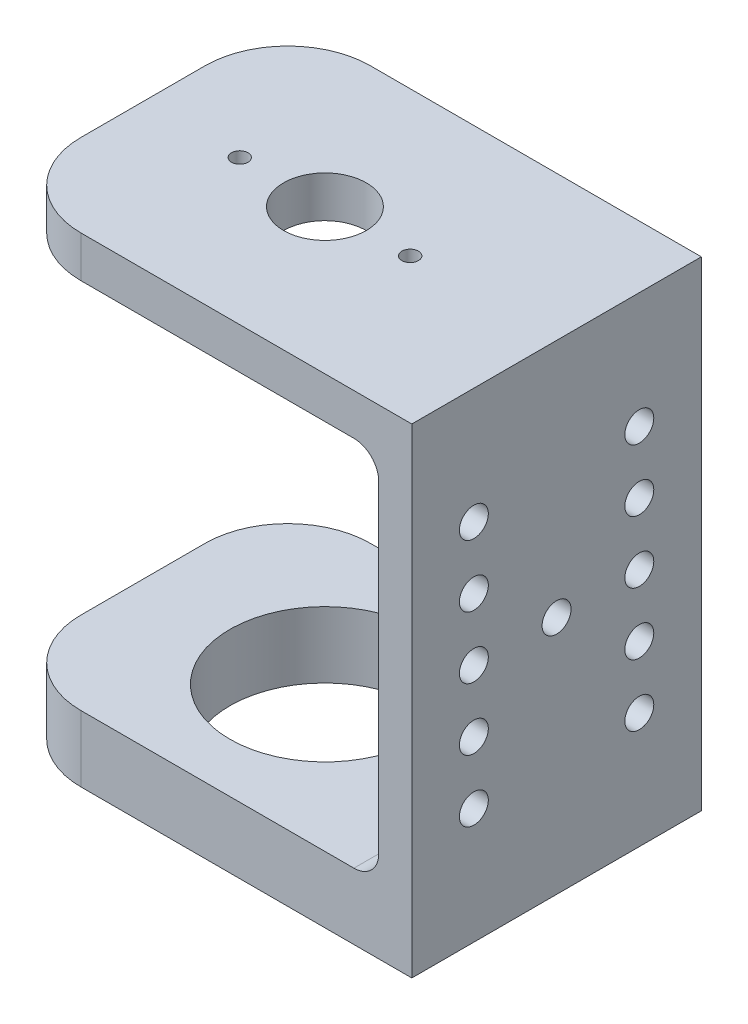
ISO-10303-21;
HEADER;
FILE_DESCRIPTION(('STEP AP214'),'2;1');
FILE_NAME('part.step','',(''),(''),'','','');
FILE_SCHEMA(('AUTOMOTIVE_DESIGN { 1 0 10303 214 1 1 1 1 }'));
ENDSEC;
DATA;
#1=APPLICATION_CONTEXT('core data for automotive mechanical design processes');
#2=APPLICATION_PROTOCOL_DEFINITION('international standard','automotive_design',2000,#1);
#3=PRODUCT_CONTEXT('',#1,'mechanical');
#4=PRODUCT('Part','Part','',(#3));
#5=PRODUCT_RELATED_PRODUCT_CATEGORY('part','',(#4));
#6=PRODUCT_DEFINITION_FORMATION('','',#4);
#7=PRODUCT_DEFINITION_CONTEXT('part definition',#1,'design');
#8=PRODUCT_DEFINITION('design','',#6,#7);
#9=PRODUCT_DEFINITION_SHAPE('','',#8);
#10=(LENGTH_UNIT() NAMED_UNIT(*) SI_UNIT(.MILLI.,.METRE.));
#11=(NAMED_UNIT(*) PLANE_ANGLE_UNIT() SI_UNIT($,.RADIAN.));
#12=(NAMED_UNIT(*) SI_UNIT($,.STERADIAN.) SOLID_ANGLE_UNIT());
#13=UNCERTAINTY_MEASURE_WITH_UNIT(LENGTH_MEASURE(1.E-05),#10,'distance_accuracy_value','');
#14=(GEOMETRIC_REPRESENTATION_CONTEXT(3) GLOBAL_UNCERTAINTY_ASSIGNED_CONTEXT((#13)) GLOBAL_UNIT_ASSIGNED_CONTEXT((#10,
#11,#12)) REPRESENTATION_CONTEXT('',''));
#15=CARTESIAN_POINT('',(0.,0.,0.));
#16=DIRECTION('',(0.,0.,1.));
#17=DIRECTION('',(1.,0.,0.));
#18=AXIS2_PLACEMENT_3D('',#15,#16,#17);
#19=CARTESIAN_POINT('',(0.,8.,0.));
#20=DIRECTION('',(0.,-1.,0.));
#21=DIRECTION('',(0.,0.,-1.));
#22=AXIS2_PLACEMENT_3D('',#19,#20,#21);
#23=PLANE('',#22);
#24=CARTESIAN_POINT('',(0.,8.,0.));
#25=DIRECTION('',(0.,1.,0.));
#26=DIRECTION('',(0.,0.,1.));
#27=AXIS2_PLACEMENT_3D('',#24,#25,#26);
#28=CIRCLE('',#27,11.5);
#29=CARTESIAN_POINT('',(0.,8.,11.5));
#30=VERTEX_POINT('',#29);
#31=EDGE_CURVE('E202',#30,#30,#28,.T.);
#32=ORIENTED_EDGE('',*,*,#31,.F.);
#33=EDGE_LOOP('',(#32));
#34=FACE_BOUND('',#33,.T.);
#35=DIRECTION('',(1.,0.,0.));
#36=VECTOR('',#35,1.);
#37=CARTESIAN_POINT('',(28.,8.,17.5));
#38=LINE('',#37,#36);
#39=CARTESIAN_POINT('',(-12.,8.,17.5));
#40=VERTEX_POINT('',#39);
#41=CARTESIAN_POINT('',(21.,8.,17.5));
#42=VERTEX_POINT('',#41);
#43=EDGE_CURVE('E178',#40,#42,#38,.T.);
#44=ORIENTED_EDGE('',*,*,#43,.T.);
#45=DIRECTION('',(0.,0.,1.));
#46=VECTOR('',#45,1.);
#47=CARTESIAN_POINT('',(21.,8.,-17.5));
#48=LINE('',#47,#46);
#49=CARTESIAN_POINT('',(21.,8.,-17.5));
#50=VERTEX_POINT('',#49);
#51=EDGE_CURVE('E74',#42,#50,#48,.F.);
#52=ORIENTED_EDGE('',*,*,#51,.T.);
#53=DIRECTION('',(-1.,0.,0.));
#54=VECTOR('',#53,1.);
#55=CARTESIAN_POINT('',(28.,8.,-17.5));
#56=LINE('',#55,#54);
#57=CARTESIAN_POINT('',(-12.,8.,-17.5));
#58=VERTEX_POINT('',#57);
#59=EDGE_CURVE('E208',#50,#58,#56,.T.);
#60=ORIENTED_EDGE('',*,*,#59,.T.);
#61=CARTESIAN_POINT('',(-12.,8.,-7.5));
#62=DIRECTION('',(0.,-1.,0.));
#63=DIRECTION('',(0.,0.,-1.));
#64=AXIS2_PLACEMENT_3D('',#61,#62,#63);
#65=CIRCLE('',#64,10.);
#66=CARTESIAN_POINT('',(-22.,8.,-7.5));
#67=VERTEX_POINT('',#66);
#68=EDGE_CURVE('E256',#58,#67,#65,.F.);
#69=ORIENTED_EDGE('',*,*,#68,.T.);
#70=DIRECTION('',(0.,0.,1.));
#71=VECTOR('',#70,1.);
#72=CARTESIAN_POINT('',(-22.,8.,-17.5));
#73=LINE('',#72,#71);
#74=CARTESIAN_POINT('',(-22.,8.,7.5));
#75=VERTEX_POINT('',#74);
#76=EDGE_CURVE('E210',#67,#75,#73,.T.);
#77=ORIENTED_EDGE('',*,*,#76,.T.);
#78=CARTESIAN_POINT('',(-12.,8.,7.5));
#79=DIRECTION('',(0.,-1.,0.));
#80=DIRECTION('',(0.,0.,-1.));
#81=AXIS2_PLACEMENT_3D('',#78,#79,#80);
#82=CIRCLE('',#81,10.);
#83=EDGE_CURVE('E254',#75,#40,#82,.F.);
#84=ORIENTED_EDGE('',*,*,#83,.T.);
#85=EDGE_LOOP('',(#44,#52,#60,#69,#77,#84));
#86=FACE_BOUND('',#85,.T.);
#87=ADVANCED_FACE('F51',(#34,#86),#23,.F.);
#88=CARTESIAN_POINT('',(0.,0.,0.));
#89=DIRECTION('',(0.,-1.,0.));
#90=DIRECTION('',(0.,0.,-1.));
#91=AXIS2_PLACEMENT_3D('',#88,#89,#90);
#92=PLANE('',#91);
#93=DIRECTION('',(0.,0.,1.));
#94=VECTOR('',#93,1.);
#95=CARTESIAN_POINT('',(-22.,0.,-17.5));
#96=LINE('',#95,#94);
#97=CARTESIAN_POINT('',(-22.,0.,-7.5));
#98=VERTEX_POINT('',#97);
#99=CARTESIAN_POINT('',(-22.,0.,7.5));
#100=VERTEX_POINT('',#99);
#101=EDGE_CURVE('E218',#98,#100,#96,.T.);
#102=ORIENTED_EDGE('',*,*,#101,.F.);
#103=CARTESIAN_POINT('',(-12.,0.,-7.5));
#104=DIRECTION('',(0.,-1.,0.));
#105=DIRECTION('',(0.,0.,-1.));
#106=AXIS2_PLACEMENT_3D('',#103,#104,#105);
#107=CIRCLE('',#106,10.);
#108=CARTESIAN_POINT('',(-12.,0.,-17.5));
#109=VERTEX_POINT('',#108);
#110=EDGE_CURVE('E252',#98,#109,#107,.T.);
#111=ORIENTED_EDGE('',*,*,#110,.T.);
#112=DIRECTION('',(-1.,0.,0.));
#113=VECTOR('',#112,1.);
#114=CARTESIAN_POINT('',(28.,0.,-17.5));
#115=LINE('',#114,#113);
#116=CARTESIAN_POINT('',(28.,0.,-17.5));
#117=VERTEX_POINT('',#116);
#118=EDGE_CURVE('E215',#117,#109,#115,.T.);
#119=ORIENTED_EDGE('',*,*,#118,.F.);
#120=DIRECTION('',(0.,0.,-1.));
#121=VECTOR('',#120,1.);
#122=CARTESIAN_POINT('',(28.,0.,-17.5));
#123=LINE('',#122,#121);
#124=CARTESIAN_POINT('',(28.,0.,17.5));
#125=VERTEX_POINT('',#124);
#126=EDGE_CURVE('E205',#125,#117,#123,.T.);
#127=ORIENTED_EDGE('',*,*,#126,.F.);
#128=DIRECTION('',(1.,0.,0.));
#129=VECTOR('',#128,1.);
#130=CARTESIAN_POINT('',(28.,0.,17.5));
#131=LINE('',#130,#129);
#132=CARTESIAN_POINT('',(-12.,0.,17.5));
#133=VERTEX_POINT('',#132);
#134=EDGE_CURVE('E173',#133,#125,#131,.T.);
#135=ORIENTED_EDGE('',*,*,#134,.F.);
#136=CARTESIAN_POINT('',(-12.,0.,7.5));
#137=DIRECTION('',(0.,-1.,0.));
#138=DIRECTION('',(0.,0.,-1.));
#139=AXIS2_PLACEMENT_3D('',#136,#137,#138);
#140=CIRCLE('',#139,10.);
#141=EDGE_CURVE('E250',#133,#100,#140,.T.);
#142=ORIENTED_EDGE('',*,*,#141,.T.);
#143=EDGE_LOOP('',(#102,#111,#119,#127,#135,#142));
#144=FACE_BOUND('',#143,.T.);
#145=CARTESIAN_POINT('',(0.,0.,0.));
#146=DIRECTION('',(0.,1.,0.));
#147=DIRECTION('',(0.,0.,1.));
#148=AXIS2_PLACEMENT_3D('',#145,#146,#147);
#149=CIRCLE('',#148,11.5);
#150=CARTESIAN_POINT('',(0.,0.,11.5));
#151=VERTEX_POINT('',#150);
#152=EDGE_CURVE('E201',#151,#151,#149,.T.);
#153=ORIENTED_EDGE('',*,*,#152,.T.);
#154=EDGE_LOOP('',(#153));
#155=FACE_BOUND('',#154,.T.);
#156=ADVANCED_FACE('F364',(#144,#155),#92,.T.);
#157=CARTESIAN_POINT('',(28.,8.,-17.5));
#158=DIRECTION('',(-1.,0.,0.));
#159=DIRECTION('',(0.,0.,1.));
#160=AXIS2_PLACEMENT_3D('',#157,#158,#159);
#161=PLANE('',#160);
#162=CARTESIAN_POINT('',(28.,29.,-10.0000000000001));
#163=DIRECTION('',(1.,0.,0.));
#164=DIRECTION('',(0.,0.,-1.));
#165=AXIS2_PLACEMENT_3D('',#162,#163,#164);
#166=CIRCLE('',#165,1.75);
#167=CARTESIAN_POINT('',(28.,29.,-11.7500000000001));
#168=VERTEX_POINT('',#167);
#169=EDGE_CURVE('E629',#168,#168,#166,.T.);
#170=ORIENTED_EDGE('',*,*,#169,.F.);
#171=EDGE_LOOP('',(#170));
#172=FACE_BOUND('',#171,.T.);
#173=CARTESIAN_POINT('',(28.,29.,9.99999999999983));
#174=DIRECTION('',(1.,0.,0.));
#175=DIRECTION('',(0.,0.,-1.));
#176=AXIS2_PLACEMENT_3D('',#173,#174,#175);
#177=CIRCLE('',#176,1.75);
#178=CARTESIAN_POINT('',(28.,29.,8.24999999999983));
#179=VERTEX_POINT('',#178);
#180=EDGE_CURVE('E630',#179,#179,#177,.T.);
#181=ORIENTED_EDGE('',*,*,#180,.F.);
#182=EDGE_LOOP('',(#181));
#183=FACE_BOUND('',#182,.T.);
#184=CARTESIAN_POINT('',(28.,21.5000000000001,9.99999999999983));
#185=DIRECTION('',(1.,0.,0.));
#186=DIRECTION('',(0.,0.,-1.));
#187=AXIS2_PLACEMENT_3D('',#184,#185,#186);
#188=CIRCLE('',#187,1.75);
#189=CARTESIAN_POINT('',(28.,21.5000000000001,8.24999999999983));
#190=VERTEX_POINT('',#189);
#191=EDGE_CURVE('E634',#190,#190,#188,.T.);
#192=ORIENTED_EDGE('',*,*,#191,.F.);
#193=EDGE_LOOP('',(#192));
#194=FACE_BOUND('',#193,.T.);
#195=CARTESIAN_POINT('',(28.,14.,-10.));
#196=DIRECTION('',(1.,0.,0.));
#197=DIRECTION('',(0.,0.,-1.));
#198=AXIS2_PLACEMENT_3D('',#195,#196,#197);
#199=CIRCLE('',#198,1.75);
#200=CARTESIAN_POINT('',(28.,14.,-11.75));
#201=VERTEX_POINT('',#200);
#202=EDGE_CURVE('E652',#201,#201,#199,.T.);
#203=ORIENTED_EDGE('',*,*,#202,.F.);
#204=EDGE_LOOP('',(#203));
#205=FACE_BOUND('',#204,.T.);
#206=CARTESIAN_POINT('',(28.,21.5000000000001,-10.0000000000001));
#207=DIRECTION('',(1.,0.,0.));
#208=DIRECTION('',(0.,0.,-1.));
#209=AXIS2_PLACEMENT_3D('',#206,#207,#208);
#210=CIRCLE('',#209,1.75);
#211=CARTESIAN_POINT('',(28.,21.5000000000001,-11.7500000000001));
#212=VERTEX_POINT('',#211);
#213=EDGE_CURVE('E650',#212,#212,#210,.T.);
#214=ORIENTED_EDGE('',*,*,#213,.F.);
#215=EDGE_LOOP('',(#214));
#216=FACE_BOUND('',#215,.T.);
#217=CARTESIAN_POINT('',(28.,14.,9.99999999999983));
#218=DIRECTION('',(1.,0.,0.));
#219=DIRECTION('',(0.,0.,-1.));
#220=AXIS2_PLACEMENT_3D('',#217,#218,#219);
#221=CIRCLE('',#220,1.75);
#222=CARTESIAN_POINT('',(28.,14.,8.24999999999983));
#223=VERTEX_POINT('',#222);
#224=EDGE_CURVE('E647',#223,#223,#221,.T.);
#225=ORIENTED_EDGE('',*,*,#224,.F.);
#226=EDGE_LOOP('',(#225));
#227=FACE_BOUND('',#226,.T.);
#228=CARTESIAN_POINT('',(28.,29.,0.));
#229=DIRECTION('',(1.,0.,0.));
#230=DIRECTION('',(0.,0.,-1.));
#231=AXIS2_PLACEMENT_3D('',#228,#229,#230);
#232=CIRCLE('',#231,1.75);
#233=CARTESIAN_POINT('',(28.,29.,-1.75));
#234=VERTEX_POINT('',#233);
#235=EDGE_CURVE('E644',#234,#234,#232,.T.);
#236=ORIENTED_EDGE('',*,*,#235,.F.);
#237=EDGE_LOOP('',(#236));
#238=FACE_BOUND('',#237,.T.);
#239=CARTESIAN_POINT('',(28.,36.5000000000001,9.99999999999986));
#240=DIRECTION('',(1.,0.,0.));
#241=DIRECTION('',(0.,0.,-1.));
#242=AXIS2_PLACEMENT_3D('',#239,#240,#241);
#243=CIRCLE('',#242,1.75);
#244=CARTESIAN_POINT('',(28.,36.5000000000001,8.24999999999986));
#245=VERTEX_POINT('',#244);
#246=EDGE_CURVE('E641',#245,#245,#243,.T.);
#247=ORIENTED_EDGE('',*,*,#246,.F.);
#248=EDGE_LOOP('',(#247));
#249=FACE_BOUND('',#248,.T.);
#250=CARTESIAN_POINT('',(28.,36.5000000000001,-10.0000000000001));
#251=DIRECTION('',(1.,0.,0.));
#252=DIRECTION('',(0.,0.,-1.));
#253=AXIS2_PLACEMENT_3D('',#250,#251,#252);
#254=CIRCLE('',#253,1.75);
#255=CARTESIAN_POINT('',(28.,36.5000000000001,-11.7500000000001));
#256=VERTEX_POINT('',#255);
#257=EDGE_CURVE('E631',#256,#256,#254,.T.);
#258=ORIENTED_EDGE('',*,*,#257,.F.);
#259=EDGE_LOOP('',(#258));
#260=FACE_BOUND('',#259,.T.);
#261=CARTESIAN_POINT('',(28.,44.0000000000001,-10.0000000000001));
#262=DIRECTION('',(1.,0.,0.));
#263=DIRECTION('',(0.,0.,-1.));
#264=AXIS2_PLACEMENT_3D('',#261,#262,#263);
#265=CIRCLE('',#264,1.75);
#266=CARTESIAN_POINT('',(28.,44.0000000000001,-11.7500000000001));
#267=VERTEX_POINT('',#266);
#268=EDGE_CURVE('E637',#267,#267,#265,.T.);
#269=ORIENTED_EDGE('',*,*,#268,.F.);
#270=EDGE_LOOP('',(#269));
#271=FACE_BOUND('',#270,.T.);
#272=CARTESIAN_POINT('',(28.,44.0000000000001,9.99999999999986));
#273=DIRECTION('',(1.,0.,0.));
#274=DIRECTION('',(0.,0.,-1.));
#275=AXIS2_PLACEMENT_3D('',#272,#273,#274);
#276=CIRCLE('',#275,1.75);
#277=CARTESIAN_POINT('',(28.,44.0000000000001,8.24999999999986));
#278=VERTEX_POINT('',#277);
#279=EDGE_CURVE('E276',#278,#278,#276,.T.);
#280=ORIENTED_EDGE('',*,*,#279,.F.);
#281=EDGE_LOOP('',(#280));
#282=FACE_BOUND('',#281,.T.);
#283=ORIENTED_EDGE('',*,*,#126,.T.);
#284=DIRECTION('',(0.,-1.,0.));
#285=VECTOR('',#284,1.);
#286=CARTESIAN_POINT('',(28.,8.,-17.5));
#287=LINE('',#286,#285);
#288=CARTESIAN_POINT('',(28.,58.,-17.5));
#289=VERTEX_POINT('',#288);
#290=EDGE_CURVE('E177',#289,#117,#287,.T.);
#291=ORIENTED_EDGE('',*,*,#290,.F.);
#292=DIRECTION('',(0.,0.,-1.));
#293=VECTOR('',#292,1.);
#294=CARTESIAN_POINT('',(28.,58.,-17.5));
#295=LINE('',#294,#293);
#296=CARTESIAN_POINT('',(28.,58.,17.5));
#297=VERTEX_POINT('',#296);
#298=EDGE_CURVE('E160',#297,#289,#295,.T.);
#299=ORIENTED_EDGE('',*,*,#298,.F.);
#300=DIRECTION('',(0.,-1.,0.));
#301=VECTOR('',#300,1.);
#302=CARTESIAN_POINT('',(28.,8.,17.5));
#303=LINE('',#302,#301);
#304=EDGE_CURVE('E169',#297,#125,#303,.T.);
#305=ORIENTED_EDGE('',*,*,#304,.T.);
#306=EDGE_LOOP('',(#283,#291,#299,#305));
#307=FACE_BOUND('',#306,.T.);
#308=ADVANCED_FACE('F180',(#172,#183,#194,#205,#216,#227,#238,#249,#260,#271,#282,#307),#161,.F.);
#309=CARTESIAN_POINT('',(28.,8.,-17.5));
#310=DIRECTION('',(0.,0.,1.));
#311=DIRECTION('',(1.,0.,0.));
#312=AXIS2_PLACEMENT_3D('',#309,#310,#311);
#313=PLANE('',#312);
#314=DIRECTION('',(0.,-1.,0.));
#315=VECTOR('',#314,1.);
#316=CARTESIAN_POINT('',(24.,53.,-17.5));
#317=LINE('',#316,#315);
#318=CARTESIAN_POINT('',(24.,50.,-17.5));
#319=VERTEX_POINT('',#318);
#320=CARTESIAN_POINT('',(24.,11.,-17.5));
#321=VERTEX_POINT('',#320);
#322=EDGE_CURVE('E198',#319,#321,#317,.T.);
#323=ORIENTED_EDGE('',*,*,#322,.F.);
#324=CARTESIAN_POINT('',(21.,50.,-17.5));
#325=DIRECTION('',(0.,0.,1.));
#326=DIRECTION('',(1.,0.,0.));
#327=AXIS2_PLACEMENT_3D('',#324,#325,#326);
#328=CIRCLE('',#327,3.);
#329=CARTESIAN_POINT('',(21.,53.,-17.5));
#330=VERTEX_POINT('',#329);
#331=EDGE_CURVE('E269',#319,#330,#328,.T.);
#332=ORIENTED_EDGE('',*,*,#331,.T.);
#333=DIRECTION('',(-1.,0.,0.));
#334=VECTOR('',#333,1.);
#335=CARTESIAN_POINT('',(-22.,53.,-17.5));
#336=LINE('',#335,#334);
#337=CARTESIAN_POINT('',(-12.,53.,-17.5));
#338=VERTEX_POINT('',#337);
#339=EDGE_CURVE('E195',#330,#338,#336,.T.);
#340=ORIENTED_EDGE('',*,*,#339,.T.);
#341=DIRECTION('',(0.,-1.,0.));
#342=VECTOR('',#341,1.);
#343=CARTESIAN_POINT('',(-12.,8.,-17.5));
#344=LINE('',#343,#342);
#345=CARTESIAN_POINT('',(-12.,58.,-17.5));
#346=VERTEX_POINT('',#345);
#347=EDGE_CURVE('E243',#338,#346,#344,.F.);
#348=ORIENTED_EDGE('',*,*,#347,.T.);
#349=DIRECTION('',(-1.,0.,0.));
#350=VECTOR('',#349,1.);
#351=CARTESIAN_POINT('',(-22.,58.,-17.5));
#352=LINE('',#351,#350);
#353=EDGE_CURVE('E182',#289,#346,#352,.T.);
#354=ORIENTED_EDGE('',*,*,#353,.F.);
#355=ORIENTED_EDGE('',*,*,#290,.T.);
#356=ORIENTED_EDGE('',*,*,#118,.T.);
#357=DIRECTION('',(0.,-1.,0.));
#358=VECTOR('',#357,1.);
#359=CARTESIAN_POINT('',(-12.,8.,-17.5));
#360=LINE('',#359,#358);
#361=EDGE_CURVE('E240',#109,#58,#360,.F.);
#362=ORIENTED_EDGE('',*,*,#361,.T.);
#363=ORIENTED_EDGE('',*,*,#59,.F.);
#364=CARTESIAN_POINT('',(21.,11.,-17.5));
#365=DIRECTION('',(0.,0.,1.));
#366=DIRECTION('',(1.,0.,0.));
#367=AXIS2_PLACEMENT_3D('',#364,#365,#366);
#368=CIRCLE('',#367,3.);
#369=EDGE_CURVE('E12',#50,#321,#368,.T.);
#370=ORIENTED_EDGE('',*,*,#369,.T.);
#371=EDGE_LOOP('',(#323,#332,#340,#348,#354,#355,#356,#362,#363,#370));
#372=FACE_BOUND('',#371,.T.);
#373=ADVANCED_FACE('F351',(#372),#313,.F.);
#374=CARTESIAN_POINT('',(-22.,8.,-17.5));
#375=DIRECTION('',(1.,0.,0.));
#376=DIRECTION('',(0.,0.,-1.));
#377=AXIS2_PLACEMENT_3D('',#374,#375,#376);
#378=PLANE('',#377);
#379=ORIENTED_EDGE('',*,*,#76,.F.);
#380=DIRECTION('',(0.,-1.,0.));
#381=VECTOR('',#380,1.);
#382=CARTESIAN_POINT('',(-22.,8.,-7.5));
#383=LINE('',#382,#381);
#384=EDGE_CURVE('E247',#67,#98,#383,.T.);
#385=ORIENTED_EDGE('',*,*,#384,.T.);
#386=ORIENTED_EDGE('',*,*,#101,.T.);
#387=DIRECTION('',(0.,-1.,0.));
#388=VECTOR('',#387,1.);
#389=CARTESIAN_POINT('',(-22.,8.,7.5));
#390=LINE('',#389,#388);
#391=EDGE_CURVE('E245',#100,#75,#390,.F.);
#392=ORIENTED_EDGE('',*,*,#391,.T.);
#393=EDGE_LOOP('',(#379,#385,#386,#392));
#394=FACE_BOUND('',#393,.T.);
#395=ADVANCED_FACE('F359',(#394),#378,.F.);
#396=CARTESIAN_POINT('',(28.,8.,17.5));
#397=DIRECTION('',(0.,0.,-1.));
#398=DIRECTION('',(-1.,0.,0.));
#399=AXIS2_PLACEMENT_3D('',#396,#397,#398);
#400=PLANE('',#399);
#401=DIRECTION('',(1.,0.,0.));
#402=VECTOR('',#401,1.);
#403=CARTESIAN_POINT('',(-22.,58.,17.5));
#404=LINE('',#403,#402);
#405=CARTESIAN_POINT('',(-12.,58.,17.5));
#406=VERTEX_POINT('',#405);
#407=EDGE_CURVE('E153',#406,#297,#404,.T.);
#408=ORIENTED_EDGE('',*,*,#407,.F.);
#409=DIRECTION('',(0.,-1.,0.));
#410=VECTOR('',#409,1.);
#411=CARTESIAN_POINT('',(-12.,8.,17.5));
#412=LINE('',#411,#410);
#413=CARTESIAN_POINT('',(-12.,53.,17.5));
#414=VERTEX_POINT('',#413);
#415=EDGE_CURVE('E225',#406,#414,#412,.T.);
#416=ORIENTED_EDGE('',*,*,#415,.T.);
#417=DIRECTION('',(1.,0.,0.));
#418=VECTOR('',#417,1.);
#419=CARTESIAN_POINT('',(-22.,53.,17.5));
#420=LINE('',#419,#418);
#421=CARTESIAN_POINT('',(21.,53.,17.5));
#422=VERTEX_POINT('',#421);
#423=EDGE_CURVE('E191',#414,#422,#420,.T.);
#424=ORIENTED_EDGE('',*,*,#423,.T.);
#425=CARTESIAN_POINT('',(21.,50.,17.5));
#426=DIRECTION('',(0.,0.,-1.));
#427=DIRECTION('',(-1.,0.,0.));
#428=AXIS2_PLACEMENT_3D('',#425,#426,#427);
#429=CIRCLE('',#428,3.);
#430=CARTESIAN_POINT('',(24.,50.,17.5));
#431=VERTEX_POINT('',#430);
#432=EDGE_CURVE('E267',#422,#431,#429,.T.);
#433=ORIENTED_EDGE('',*,*,#432,.T.);
#434=DIRECTION('',(0.,-1.,0.));
#435=VECTOR('',#434,1.);
#436=CARTESIAN_POINT('',(24.,53.,17.5));
#437=LINE('',#436,#435);
#438=CARTESIAN_POINT('',(24.,11.,17.5));
#439=VERTEX_POINT('',#438);
#440=EDGE_CURVE('E184',#431,#439,#437,.T.);
#441=ORIENTED_EDGE('',*,*,#440,.T.);
#442=CARTESIAN_POINT('',(21.,11.,17.5));
#443=DIRECTION('',(0.,0.,-1.));
#444=DIRECTION('',(-1.,0.,0.));
#445=AXIS2_PLACEMENT_3D('',#442,#443,#444);
#446=CIRCLE('',#445,3.);
#447=EDGE_CURVE('E60',#439,#42,#446,.T.);
#448=ORIENTED_EDGE('',*,*,#447,.T.);
#449=ORIENTED_EDGE('',*,*,#43,.F.);
#450=DIRECTION('',(0.,-1.,0.));
#451=VECTOR('',#450,1.);
#452=CARTESIAN_POINT('',(-12.,8.,17.5));
#453=LINE('',#452,#451);
#454=EDGE_CURVE('E223',#40,#133,#453,.T.);
#455=ORIENTED_EDGE('',*,*,#454,.T.);
#456=ORIENTED_EDGE('',*,*,#134,.T.);
#457=ORIENTED_EDGE('',*,*,#304,.F.);
#458=EDGE_LOOP('',(#408,#416,#424,#433,#441,#448,#449,#455,#456,#457));
#459=FACE_BOUND('',#458,.T.);
#460=ADVANCED_FACE('F170',(#459),#400,.F.);
#461=CARTESIAN_POINT('',(0.,8.,0.));
#462=DIRECTION('',(0.,-1.,0.));
#463=DIRECTION('',(0.,0.,-1.));
#464=AXIS2_PLACEMENT_3D('',#461,#462,#463);
#465=CYLINDRICAL_SURFACE('',#464,11.5);
#466=ORIENTED_EDGE('',*,*,#31,.T.);
#467=EDGE_LOOP('',(#466));
#468=FACE_BOUND('',#467,.T.);
#469=ORIENTED_EDGE('',*,*,#152,.F.);
#470=EDGE_LOOP('',(#469));
#471=FACE_BOUND('',#470,.T.);
#472=ADVANCED_FACE('F387',(#468,#471),#465,.F.);
#473=CARTESIAN_POINT('',(24.,53.,-17.5));
#474=DIRECTION('',(1.,0.,0.));
#475=DIRECTION('',(0.,0.,-1.));
#476=AXIS2_PLACEMENT_3D('',#473,#474,#475);
#477=PLANE('',#476);
#478=CARTESIAN_POINT('',(24.,29.,-10.0000000000001));
#479=DIRECTION('',(1.,0.,0.));
#480=DIRECTION('',(0.,0.,-1.));
#481=AXIS2_PLACEMENT_3D('',#478,#479,#480);
#482=CIRCLE('',#481,1.75);
#483=CARTESIAN_POINT('',(24.,29.,-11.7500000000001));
#484=VERTEX_POINT('',#483);
#485=EDGE_CURVE('E55',#484,#484,#482,.T.);
#486=ORIENTED_EDGE('',*,*,#485,.T.);
#487=EDGE_LOOP('',(#486));
#488=FACE_BOUND('',#487,.T.);
#489=CARTESIAN_POINT('',(24.,29.,9.99999999999983));
#490=DIRECTION('',(1.,0.,0.));
#491=DIRECTION('',(0.,0.,-1.));
#492=AXIS2_PLACEMENT_3D('',#489,#490,#491);
#493=CIRCLE('',#492,1.75);
#494=CARTESIAN_POINT('',(24.,29.,8.24999999999983));
#495=VERTEX_POINT('',#494);
#496=EDGE_CURVE('E299',#495,#495,#493,.T.);
#497=ORIENTED_EDGE('',*,*,#496,.T.);
#498=EDGE_LOOP('',(#497));
#499=FACE_BOUND('',#498,.T.);
#500=CARTESIAN_POINT('',(24.,21.5000000000001,9.99999999999983));
#501=DIRECTION('',(1.,0.,0.));
#502=DIRECTION('',(0.,0.,-1.));
#503=AXIS2_PLACEMENT_3D('',#500,#501,#502);
#504=CIRCLE('',#503,1.75);
#505=CARTESIAN_POINT('',(24.,21.5000000000001,8.24999999999983));
#506=VERTEX_POINT('',#505);
#507=EDGE_CURVE('E297',#506,#506,#504,.T.);
#508=ORIENTED_EDGE('',*,*,#507,.T.);
#509=EDGE_LOOP('',(#508));
#510=FACE_BOUND('',#509,.T.);
#511=CARTESIAN_POINT('',(24.,14.,-10.));
#512=DIRECTION('',(1.,0.,0.));
#513=DIRECTION('',(0.,0.,-1.));
#514=AXIS2_PLACEMENT_3D('',#511,#512,#513);
#515=CIRCLE('',#514,1.75);
#516=CARTESIAN_POINT('',(24.,14.,-11.75));
#517=VERTEX_POINT('',#516);
#518=EDGE_CURVE('E294',#517,#517,#515,.T.);
#519=ORIENTED_EDGE('',*,*,#518,.T.);
#520=EDGE_LOOP('',(#519));
#521=FACE_BOUND('',#520,.T.);
#522=CARTESIAN_POINT('',(24.,21.5000000000001,-10.0000000000001));
#523=DIRECTION('',(1.,0.,0.));
#524=DIRECTION('',(0.,0.,-1.));
#525=AXIS2_PLACEMENT_3D('',#522,#523,#524);
#526=CIRCLE('',#525,1.75);
#527=CARTESIAN_POINT('',(24.,21.5000000000001,-11.7500000000001));
#528=VERTEX_POINT('',#527);
#529=EDGE_CURVE('E291',#528,#528,#526,.T.);
#530=ORIENTED_EDGE('',*,*,#529,.T.);
#531=EDGE_LOOP('',(#530));
#532=FACE_BOUND('',#531,.T.);
#533=CARTESIAN_POINT('',(24.,14.,9.99999999999983));
#534=DIRECTION('',(1.,0.,0.));
#535=DIRECTION('',(0.,0.,-1.));
#536=AXIS2_PLACEMENT_3D('',#533,#534,#535);
#537=CIRCLE('',#536,1.75);
#538=CARTESIAN_POINT('',(24.,14.,8.24999999999983));
#539=VERTEX_POINT('',#538);
#540=EDGE_CURVE('E288',#539,#539,#537,.T.);
#541=ORIENTED_EDGE('',*,*,#540,.T.);
#542=EDGE_LOOP('',(#541));
#543=FACE_BOUND('',#542,.T.);
#544=CARTESIAN_POINT('',(24.,29.,0.));
#545=DIRECTION('',(1.,0.,0.));
#546=DIRECTION('',(0.,0.,-1.));
#547=AXIS2_PLACEMENT_3D('',#544,#545,#546);
#548=CIRCLE('',#547,1.75);
#549=CARTESIAN_POINT('',(24.,29.,-1.75));
#550=VERTEX_POINT('',#549);
#551=EDGE_CURVE('E285',#550,#550,#548,.T.);
#552=ORIENTED_EDGE('',*,*,#551,.T.);
#553=EDGE_LOOP('',(#552));
#554=FACE_BOUND('',#553,.T.);
#555=CARTESIAN_POINT('',(24.,36.5000000000001,9.99999999999986));
#556=DIRECTION('',(1.,0.,0.));
#557=DIRECTION('',(0.,0.,-1.));
#558=AXIS2_PLACEMENT_3D('',#555,#556,#557);
#559=CIRCLE('',#558,1.75);
#560=CARTESIAN_POINT('',(24.,36.5000000000001,8.24999999999986));
#561=VERTEX_POINT('',#560);
#562=EDGE_CURVE('E282',#561,#561,#559,.T.);
#563=ORIENTED_EDGE('',*,*,#562,.T.);
#564=EDGE_LOOP('',(#563));
#565=FACE_BOUND('',#564,.T.);
#566=CARTESIAN_POINT('',(24.,36.5000000000001,-10.0000000000001));
#567=DIRECTION('',(1.,0.,0.));
#568=DIRECTION('',(0.,0.,-1.));
#569=AXIS2_PLACEMENT_3D('',#566,#567,#568);
#570=CIRCLE('',#569,1.75);
#571=CARTESIAN_POINT('',(24.,36.5000000000001,-11.7500000000001));
#572=VERTEX_POINT('',#571);
#573=EDGE_CURVE('E279',#572,#572,#570,.T.);
#574=ORIENTED_EDGE('',*,*,#573,.T.);
#575=EDGE_LOOP('',(#574));
#576=FACE_BOUND('',#575,.T.);
#577=CARTESIAN_POINT('',(24.,44.0000000000001,-10.0000000000001));
#578=DIRECTION('',(1.,0.,0.));
#579=DIRECTION('',(0.,0.,-1.));
#580=AXIS2_PLACEMENT_3D('',#577,#578,#579);
#581=CIRCLE('',#580,1.75);
#582=CARTESIAN_POINT('',(24.,44.0000000000001,-11.7500000000001));
#583=VERTEX_POINT('',#582);
#584=EDGE_CURVE('E275',#583,#583,#581,.T.);
#585=ORIENTED_EDGE('',*,*,#584,.T.);
#586=EDGE_LOOP('',(#585));
#587=FACE_BOUND('',#586,.T.);
#588=CARTESIAN_POINT('',(24.,44.0000000000001,9.99999999999986));
#589=DIRECTION('',(1.,0.,0.));
#590=DIRECTION('',(0.,0.,-1.));
#591=AXIS2_PLACEMENT_3D('',#588,#589,#590);
#592=CIRCLE('',#591,1.75);
#593=CARTESIAN_POINT('',(24.,44.0000000000001,8.24999999999986));
#594=VERTEX_POINT('',#593);
#595=EDGE_CURVE('E272',#594,#594,#592,.T.);
#596=ORIENTED_EDGE('',*,*,#595,.T.);
#597=EDGE_LOOP('',(#596));
#598=FACE_BOUND('',#597,.T.);
#599=ORIENTED_EDGE('',*,*,#440,.F.);
#600=DIRECTION('',(0.,0.,1.));
#601=VECTOR('',#600,1.);
#602=CARTESIAN_POINT('',(24.,50.,-17.5));
#603=LINE('',#602,#601);
#604=EDGE_CURVE('E264',#431,#319,#603,.F.);
#605=ORIENTED_EDGE('',*,*,#604,.T.);
#606=ORIENTED_EDGE('',*,*,#322,.T.);
#607=DIRECTION('',(0.,0.,1.));
#608=VECTOR('',#607,1.);
#609=CARTESIAN_POINT('',(24.,11.,17.5));
#610=LINE('',#609,#608);
#611=EDGE_CURVE('E261',#321,#439,#610,.T.);
#612=ORIENTED_EDGE('',*,*,#611,.T.);
#613=EDGE_LOOP('',(#599,#605,#606,#612));
#614=FACE_BOUND('',#613,.T.);
#615=ADVANCED_FACE('F345',(#488,#499,#510,#521,#532,#543,#554,#565,#576,#587,#598,#614),#477,.F.);
#616=CARTESIAN_POINT('',(0.,53.,0.));
#617=DIRECTION('',(0.,1.,0.));
#618=DIRECTION('',(0.,0.,1.));
#619=AXIS2_PLACEMENT_3D('',#616,#617,#618);
#620=PLANE('',#619);
#621=CARTESIAN_POINT('',(0.,53.,0.));
#622=DIRECTION('',(0.,1.,0.));
#623=DIRECTION('',(0.,0.,1.));
#624=AXIS2_PLACEMENT_3D('',#621,#622,#623);
#625=CIRCLE('',#624,5.);
#626=CARTESIAN_POINT('',(0.,53.,5.));
#627=VERTEX_POINT('',#626);
#628=EDGE_CURVE('E320',#627,#627,#625,.T.);
#629=ORIENTED_EDGE('',*,*,#628,.T.);
#630=EDGE_LOOP('',(#629));
#631=FACE_BOUND('',#630,.T.);
#632=CARTESIAN_POINT('',(10.3,53.,0.));
#633=DIRECTION('',(0.,1.,0.));
#634=DIRECTION('',(0.,0.,1.));
#635=AXIS2_PLACEMENT_3D('',#632,#633,#634);
#636=CIRCLE('',#635,1.);
#637=CARTESIAN_POINT('',(10.3,53.,1.));
#638=VERTEX_POINT('',#637);
#639=EDGE_CURVE('E313',#638,#638,#636,.T.);
#640=ORIENTED_EDGE('',*,*,#639,.T.);
#641=EDGE_LOOP('',(#640));
#642=FACE_BOUND('',#641,.T.);
#643=CARTESIAN_POINT('',(-10.3,53.,0.));
#644=DIRECTION('',(0.,1.,0.));
#645=DIRECTION('',(0.,0.,1.));
#646=AXIS2_PLACEMENT_3D('',#643,#644,#645);
#647=CIRCLE('',#646,1.);
#648=CARTESIAN_POINT('',(-10.3,53.,1.));
#649=VERTEX_POINT('',#648);
#650=EDGE_CURVE('E304',#649,#649,#647,.T.);
#651=ORIENTED_EDGE('',*,*,#650,.T.);
#652=EDGE_LOOP('',(#651));
#653=FACE_BOUND('',#652,.T.);
#654=ORIENTED_EDGE('',*,*,#339,.F.);
#655=DIRECTION('',(0.,0.,1.));
#656=VECTOR('',#655,1.);
#657=CARTESIAN_POINT('',(21.,53.,17.5));
#658=LINE('',#657,#656);
#659=EDGE_CURVE('E258',#330,#422,#658,.T.);
#660=ORIENTED_EDGE('',*,*,#659,.T.);
#661=ORIENTED_EDGE('',*,*,#423,.F.);
#662=CARTESIAN_POINT('',(-12.,53.,7.5));
#663=DIRECTION('',(0.,1.,0.));
#664=DIRECTION('',(0.,0.,1.));
#665=AXIS2_PLACEMENT_3D('',#662,#663,#664);
#666=CIRCLE('',#665,10.);
#667=CARTESIAN_POINT('',(-22.,53.,7.5));
#668=VERTEX_POINT('',#667);
#669=EDGE_CURVE('E230',#414,#668,#666,.F.);
#670=ORIENTED_EDGE('',*,*,#669,.T.);
#671=DIRECTION('',(0.,0.,1.));
#672=VECTOR('',#671,1.);
#673=CARTESIAN_POINT('',(-22.,53.,-17.5));
#674=LINE('',#673,#672);
#675=CARTESIAN_POINT('',(-22.,53.,-7.5));
#676=VERTEX_POINT('',#675);
#677=EDGE_CURVE('E188',#676,#668,#674,.T.);
#678=ORIENTED_EDGE('',*,*,#677,.F.);
#679=CARTESIAN_POINT('',(-12.,53.,-7.5));
#680=DIRECTION('',(0.,1.,0.));
#681=DIRECTION('',(0.,0.,1.));
#682=AXIS2_PLACEMENT_3D('',#679,#680,#681);
#683=CIRCLE('',#682,10.);
#684=EDGE_CURVE('E227',#676,#338,#683,.F.);
#685=ORIENTED_EDGE('',*,*,#684,.T.);
#686=EDGE_LOOP('',(#654,#660,#661,#670,#678,#685));
#687=FACE_BOUND('',#686,.T.);
#688=ADVANCED_FACE('F336',(#631,#642,#653,#687),#620,.F.);
#689=CARTESIAN_POINT('',(0.,58.,0.));
#690=DIRECTION('',(0.,1.,0.));
#691=DIRECTION('',(0.,0.,1.));
#692=AXIS2_PLACEMENT_3D('',#689,#690,#691);
#693=PLANE('',#692);
#694=CARTESIAN_POINT('',(10.3,58.,0.));
#695=DIRECTION('',(0.,1.,0.));
#696=DIRECTION('',(0.,0.,1.));
#697=AXIS2_PLACEMENT_3D('',#694,#695,#696);
#698=CIRCLE('',#697,1.);
#699=CARTESIAN_POINT('',(10.3,58.,1.));
#700=VERTEX_POINT('',#699);
#701=EDGE_CURVE('E317',#700,#700,#698,.T.);
#702=ORIENTED_EDGE('',*,*,#701,.F.);
#703=EDGE_LOOP('',(#702));
#704=FACE_BOUND('',#703,.T.);
#705=DIRECTION('',(0.,0.,1.));
#706=VECTOR('',#705,1.);
#707=CARTESIAN_POINT('',(-22.,58.,-17.5));
#708=LINE('',#707,#706);
#709=CARTESIAN_POINT('',(-22.,58.,-7.5));
#710=VERTEX_POINT('',#709);
#711=CARTESIAN_POINT('',(-22.,58.,7.5));
#712=VERTEX_POINT('',#711);
#713=EDGE_CURVE('E166',#710,#712,#708,.T.);
#714=ORIENTED_EDGE('',*,*,#713,.T.);
#715=CARTESIAN_POINT('',(-12.,58.,7.5));
#716=DIRECTION('',(0.,1.,0.));
#717=DIRECTION('',(0.,0.,1.));
#718=AXIS2_PLACEMENT_3D('',#715,#716,#717);
#719=CIRCLE('',#718,10.);
#720=EDGE_CURVE('E163',#712,#406,#719,.T.);
#721=ORIENTED_EDGE('',*,*,#720,.T.);
#722=ORIENTED_EDGE('',*,*,#407,.T.);
#723=ORIENTED_EDGE('',*,*,#298,.T.);
#724=ORIENTED_EDGE('',*,*,#353,.T.);
#725=CARTESIAN_POINT('',(-12.,58.,-7.5));
#726=DIRECTION('',(0.,1.,0.));
#727=DIRECTION('',(0.,0.,1.));
#728=AXIS2_PLACEMENT_3D('',#725,#726,#727);
#729=CIRCLE('',#728,10.);
#730=EDGE_CURVE('E237',#346,#710,#729,.T.);
#731=ORIENTED_EDGE('',*,*,#730,.T.);
#732=EDGE_LOOP('',(#714,#721,#722,#723,#724,#731));
#733=FACE_BOUND('',#732,.T.);
#734=CARTESIAN_POINT('',(0.,58.,0.));
#735=DIRECTION('',(0.,1.,0.));
#736=DIRECTION('',(0.,0.,1.));
#737=AXIS2_PLACEMENT_3D('',#734,#735,#736);
#738=CIRCLE('',#737,5.);
#739=CARTESIAN_POINT('',(0.,58.,5.));
#740=VERTEX_POINT('',#739);
#741=EDGE_CURVE('E192',#740,#740,#738,.T.);
#742=ORIENTED_EDGE('',*,*,#741,.F.);
#743=EDGE_LOOP('',(#742));
#744=FACE_BOUND('',#743,.T.);
#745=CARTESIAN_POINT('',(-10.3,58.,0.));
#746=DIRECTION('',(0.,1.,0.));
#747=DIRECTION('',(0.,0.,1.));
#748=AXIS2_PLACEMENT_3D('',#745,#746,#747);
#749=CIRCLE('',#748,1.);
#750=CARTESIAN_POINT('',(-10.3,58.,1.));
#751=VERTEX_POINT('',#750);
#752=EDGE_CURVE('E308',#751,#751,#749,.T.);
#753=ORIENTED_EDGE('',*,*,#752,.F.);
#754=EDGE_LOOP('',(#753));
#755=FACE_BOUND('',#754,.T.);
#756=ADVANCED_FACE('F156',(#704,#733,#744,#755),#693,.T.);
#757=CARTESIAN_POINT('',(-22.,58.,-17.5));
#758=DIRECTION('',(1.,0.,0.));
#759=DIRECTION('',(0.,0.,-1.));
#760=AXIS2_PLACEMENT_3D('',#757,#758,#759);
#761=PLANE('',#760);
#762=ORIENTED_EDGE('',*,*,#677,.T.);
#763=DIRECTION('',(0.,-1.,0.));
#764=VECTOR('',#763,1.);
#765=CARTESIAN_POINT('',(-22.,58.,7.5));
#766=LINE('',#765,#764);
#767=EDGE_CURVE('E235',#668,#712,#766,.F.);
#768=ORIENTED_EDGE('',*,*,#767,.T.);
#769=ORIENTED_EDGE('',*,*,#713,.F.);
#770=DIRECTION('',(0.,-1.,0.));
#771=VECTOR('',#770,1.);
#772=CARTESIAN_POINT('',(-22.,58.,-7.5));
#773=LINE('',#772,#771);
#774=EDGE_CURVE('E232',#710,#676,#773,.T.);
#775=ORIENTED_EDGE('',*,*,#774,.T.);
#776=EDGE_LOOP('',(#762,#768,#769,#775));
#777=FACE_BOUND('',#776,.T.);
#778=ADVANCED_FACE('F406',(#777),#761,.F.);
#779=CARTESIAN_POINT('',(0.,58.,0.));
#780=DIRECTION('',(0.,-1.,0.));
#781=DIRECTION('',(0.,0.,-1.));
#782=AXIS2_PLACEMENT_3D('',#779,#780,#781);
#783=CYLINDRICAL_SURFACE('',#782,5.);
#784=ORIENTED_EDGE('',*,*,#741,.T.);
#785=EDGE_LOOP('',(#784));
#786=FACE_BOUND('',#785,.T.);
#787=ORIENTED_EDGE('',*,*,#628,.F.);
#788=EDGE_LOOP('',(#787));
#789=FACE_BOUND('',#788,.T.);
#790=ADVANCED_FACE('F408',(#786,#789),#783,.F.);
#791=CARTESIAN_POINT('',(10.3,58.,0.));
#792=DIRECTION('',(0.,-1.,0.));
#793=DIRECTION('',(0.,0.,-1.));
#794=AXIS2_PLACEMENT_3D('',#791,#792,#793);
#795=CYLINDRICAL_SURFACE('',#794,1.);
#796=ORIENTED_EDGE('',*,*,#701,.T.);
#797=EDGE_LOOP('',(#796));
#798=FACE_BOUND('',#797,.T.);
#799=ORIENTED_EDGE('',*,*,#639,.F.);
#800=EDGE_LOOP('',(#799));
#801=FACE_BOUND('',#800,.T.);
#802=ADVANCED_FACE('F415',(#798,#801),#795,.F.);
#803=CARTESIAN_POINT('',(-10.3,58.,0.));
#804=DIRECTION('',(0.,-1.,0.));
#805=DIRECTION('',(0.,0.,-1.));
#806=AXIS2_PLACEMENT_3D('',#803,#804,#805);
#807=CYLINDRICAL_SURFACE('',#806,1.);
#808=ORIENTED_EDGE('',*,*,#752,.T.);
#809=EDGE_LOOP('',(#808));
#810=FACE_BOUND('',#809,.T.);
#811=ORIENTED_EDGE('',*,*,#650,.F.);
#812=EDGE_LOOP('',(#811));
#813=FACE_BOUND('',#812,.T.);
#814=ADVANCED_FACE('F400',(#810,#813),#807,.F.);
#815=CARTESIAN_POINT('',(-12.,8.,7.5));
#816=DIRECTION('',(0.,-1.,0.));
#817=DIRECTION('',(0.,0.,-1.));
#818=AXIS2_PLACEMENT_3D('',#815,#816,#817);
#819=CYLINDRICAL_SURFACE('',#818,10.);
#820=ORIENTED_EDGE('',*,*,#720,.F.);
#821=ORIENTED_EDGE('',*,*,#767,.F.);
#822=ORIENTED_EDGE('',*,*,#669,.F.);
#823=ORIENTED_EDGE('',*,*,#415,.F.);
#824=EDGE_LOOP('',(#820,#821,#822,#823));
#825=FACE_BOUND('',#824,.T.);
#826=ADVANCED_FACE('F332',(#825),#819,.T.);
#827=CARTESIAN_POINT('',(-12.,58.,-7.5));
#828=DIRECTION('',(0.,-1.,0.));
#829=DIRECTION('',(0.,0.,-1.));
#830=AXIS2_PLACEMENT_3D('',#827,#828,#829);
#831=CYLINDRICAL_SURFACE('',#830,10.);
#832=ORIENTED_EDGE('',*,*,#730,.F.);
#833=ORIENTED_EDGE('',*,*,#347,.F.);
#834=ORIENTED_EDGE('',*,*,#684,.F.);
#835=ORIENTED_EDGE('',*,*,#774,.F.);
#836=EDGE_LOOP('',(#832,#833,#834,#835));
#837=FACE_BOUND('',#836,.T.);
#838=ADVANCED_FACE('F375',(#837),#831,.T.);
#839=CARTESIAN_POINT('',(-12.,8.,-7.5));
#840=DIRECTION('',(0.,-1.,0.));
#841=DIRECTION('',(0.,0.,-1.));
#842=AXIS2_PLACEMENT_3D('',#839,#840,#841);
#843=CYLINDRICAL_SURFACE('',#842,10.);
#844=ORIENTED_EDGE('',*,*,#68,.F.);
#845=ORIENTED_EDGE('',*,*,#361,.F.);
#846=ORIENTED_EDGE('',*,*,#110,.F.);
#847=ORIENTED_EDGE('',*,*,#384,.F.);
#848=EDGE_LOOP('',(#844,#845,#846,#847));
#849=FACE_BOUND('',#848,.T.);
#850=ADVANCED_FACE('F362',(#849),#843,.T.);
#851=CARTESIAN_POINT('',(-12.,8.,7.5));
#852=DIRECTION('',(0.,-1.,0.));
#853=DIRECTION('',(0.,0.,-1.));
#854=AXIS2_PLACEMENT_3D('',#851,#852,#853);
#855=CYLINDRICAL_SURFACE('',#854,10.);
#856=ORIENTED_EDGE('',*,*,#83,.F.);
#857=ORIENTED_EDGE('',*,*,#391,.F.);
#858=ORIENTED_EDGE('',*,*,#141,.F.);
#859=ORIENTED_EDGE('',*,*,#454,.F.);
#860=EDGE_LOOP('',(#856,#857,#858,#859));
#861=FACE_BOUND('',#860,.T.);
#862=ADVANCED_FACE('F368',(#861),#855,.T.);
#863=CARTESIAN_POINT('',(21.,50.,0.));
#864=DIRECTION('',(0.,0.,-1.));
#865=DIRECTION('',(-1.,0.,0.));
#866=AXIS2_PLACEMENT_3D('',#863,#864,#865);
#867=CYLINDRICAL_SURFACE('',#866,3.);
#868=ORIENTED_EDGE('',*,*,#331,.F.);
#869=ORIENTED_EDGE('',*,*,#604,.F.);
#870=ORIENTED_EDGE('',*,*,#432,.F.);
#871=ORIENTED_EDGE('',*,*,#659,.F.);
#872=EDGE_LOOP('',(#868,#869,#870,#871));
#873=FACE_BOUND('',#872,.T.);
#874=ADVANCED_FACE('F341',(#873),#867,.F.);
#875=CARTESIAN_POINT('',(21.,11.,-17.5));
#876=DIRECTION('',(0.,0.,-1.));
#877=DIRECTION('',(-1.,0.,0.));
#878=AXIS2_PLACEMENT_3D('',#875,#876,#877);
#879=CYLINDRICAL_SURFACE('',#878,3.);
#880=ORIENTED_EDGE('',*,*,#369,.F.);
#881=ORIENTED_EDGE('',*,*,#51,.F.);
#882=ORIENTED_EDGE('',*,*,#447,.F.);
#883=ORIENTED_EDGE('',*,*,#611,.F.);
#884=EDGE_LOOP('',(#880,#881,#882,#883));
#885=FACE_BOUND('',#884,.T.);
#886=ADVANCED_FACE('F53',(#885),#879,.F.);
#887=CARTESIAN_POINT('',(-22.,44.0000000000001,9.99999999999986));
#888=DIRECTION('',(1.,0.,0.));
#889=DIRECTION('',(0.,0.,-1.));
#890=AXIS2_PLACEMENT_3D('',#887,#888,#889);
#891=CYLINDRICAL_SURFACE('',#890,1.75);
#892=ORIENTED_EDGE('',*,*,#279,.T.);
#893=EDGE_LOOP('',(#892));
#894=FACE_BOUND('',#893,.T.);
#895=ORIENTED_EDGE('',*,*,#595,.F.);
#896=EDGE_LOOP('',(#895));
#897=FACE_BOUND('',#896,.T.);
#898=ADVANCED_FACE('F448',(#894,#897),#891,.F.);
#899=CARTESIAN_POINT('',(-22.,44.0000000000001,-10.0000000000001));
#900=DIRECTION('',(1.,0.,0.));
#901=DIRECTION('',(0.,0.,-1.));
#902=AXIS2_PLACEMENT_3D('',#899,#900,#901);
#903=CYLINDRICAL_SURFACE('',#902,1.75);
#904=ORIENTED_EDGE('',*,*,#268,.T.);
#905=EDGE_LOOP('',(#904));
#906=FACE_BOUND('',#905,.T.);
#907=ORIENTED_EDGE('',*,*,#584,.F.);
#908=EDGE_LOOP('',(#907));
#909=FACE_BOUND('',#908,.T.);
#910=ADVANCED_FACE('F450',(#906,#909),#903,.F.);
#911=CARTESIAN_POINT('',(-22.,36.5000000000001,-10.0000000000001));
#912=DIRECTION('',(1.,0.,0.));
#913=DIRECTION('',(0.,0.,-1.));
#914=AXIS2_PLACEMENT_3D('',#911,#912,#913);
#915=CYLINDRICAL_SURFACE('',#914,1.75);
#916=ORIENTED_EDGE('',*,*,#257,.T.);
#917=EDGE_LOOP('',(#916));
#918=FACE_BOUND('',#917,.T.);
#919=ORIENTED_EDGE('',*,*,#573,.F.);
#920=EDGE_LOOP('',(#919));
#921=FACE_BOUND('',#920,.T.);
#922=ADVANCED_FACE('F456',(#918,#921),#915,.F.);
#923=CARTESIAN_POINT('',(-22.,36.5000000000001,9.99999999999986));
#924=DIRECTION('',(1.,0.,0.));
#925=DIRECTION('',(0.,0.,-1.));
#926=AXIS2_PLACEMENT_3D('',#923,#924,#925);
#927=CYLINDRICAL_SURFACE('',#926,1.75);
#928=ORIENTED_EDGE('',*,*,#246,.T.);
#929=EDGE_LOOP('',(#928));
#930=FACE_BOUND('',#929,.T.);
#931=ORIENTED_EDGE('',*,*,#562,.F.);
#932=EDGE_LOOP('',(#931));
#933=FACE_BOUND('',#932,.T.);
#934=ADVANCED_FACE('F527',(#930,#933),#927,.F.);
#935=CARTESIAN_POINT('',(-22.,29.,0.));
#936=DIRECTION('',(1.,0.,0.));
#937=DIRECTION('',(0.,0.,-1.));
#938=AXIS2_PLACEMENT_3D('',#935,#936,#937);
#939=CYLINDRICAL_SURFACE('',#938,1.75);
#940=ORIENTED_EDGE('',*,*,#235,.T.);
#941=EDGE_LOOP('',(#940));
#942=FACE_BOUND('',#941,.T.);
#943=ORIENTED_EDGE('',*,*,#551,.F.);
#944=EDGE_LOOP('',(#943));
#945=FACE_BOUND('',#944,.T.);
#946=ADVANCED_FACE('F539',(#942,#945),#939,.F.);
#947=CARTESIAN_POINT('',(-22.,14.,9.99999999999983));
#948=DIRECTION('',(1.,0.,0.));
#949=DIRECTION('',(0.,0.,-1.));
#950=AXIS2_PLACEMENT_3D('',#947,#948,#949);
#951=CYLINDRICAL_SURFACE('',#950,1.75);
#952=ORIENTED_EDGE('',*,*,#224,.T.);
#953=EDGE_LOOP('',(#952));
#954=FACE_BOUND('',#953,.T.);
#955=ORIENTED_EDGE('',*,*,#540,.F.);
#956=EDGE_LOOP('',(#955));
#957=FACE_BOUND('',#956,.T.);
#958=ADVANCED_FACE('F548',(#954,#957),#951,.F.);
#959=CARTESIAN_POINT('',(-22.,21.5000000000001,-10.0000000000001));
#960=DIRECTION('',(1.,0.,0.));
#961=DIRECTION('',(0.,0.,-1.));
#962=AXIS2_PLACEMENT_3D('',#959,#960,#961);
#963=CYLINDRICAL_SURFACE('',#962,1.75);
#964=ORIENTED_EDGE('',*,*,#213,.T.);
#965=EDGE_LOOP('',(#964));
#966=FACE_BOUND('',#965,.T.);
#967=ORIENTED_EDGE('',*,*,#529,.F.);
#968=EDGE_LOOP('',(#967));
#969=FACE_BOUND('',#968,.T.);
#970=ADVANCED_FACE('F462',(#966,#969),#963,.F.);
#971=CARTESIAN_POINT('',(-22.,14.,-10.));
#972=DIRECTION('',(1.,0.,0.));
#973=DIRECTION('',(0.,0.,-1.));
#974=AXIS2_PLACEMENT_3D('',#971,#972,#973);
#975=CYLINDRICAL_SURFACE('',#974,1.75);
#976=ORIENTED_EDGE('',*,*,#202,.T.);
#977=EDGE_LOOP('',(#976));
#978=FACE_BOUND('',#977,.T.);
#979=ORIENTED_EDGE('',*,*,#518,.F.);
#980=EDGE_LOOP('',(#979));
#981=FACE_BOUND('',#980,.T.);
#982=ADVANCED_FACE('F573',(#978,#981),#975,.F.);
#983=CARTESIAN_POINT('',(-22.,21.5000000000001,9.99999999999983));
#984=DIRECTION('',(1.,0.,0.));
#985=DIRECTION('',(0.,0.,-1.));
#986=AXIS2_PLACEMENT_3D('',#983,#984,#985);
#987=CYLINDRICAL_SURFACE('',#986,1.75);
#988=ORIENTED_EDGE('',*,*,#191,.T.);
#989=EDGE_LOOP('',(#988));
#990=FACE_BOUND('',#989,.T.);
#991=ORIENTED_EDGE('',*,*,#507,.F.);
#992=EDGE_LOOP('',(#991));
#993=FACE_BOUND('',#992,.T.);
#994=ADVANCED_FACE('F581',(#990,#993),#987,.F.);
#995=CARTESIAN_POINT('',(-22.,29.,9.99999999999983));
#996=DIRECTION('',(1.,0.,0.));
#997=DIRECTION('',(0.,0.,-1.));
#998=AXIS2_PLACEMENT_3D('',#995,#996,#997);
#999=CYLINDRICAL_SURFACE('',#998,1.75);
#1000=ORIENTED_EDGE('',*,*,#180,.T.);
#1001=EDGE_LOOP('',(#1000));
#1002=FACE_BOUND('',#1001,.T.);
#1003=ORIENTED_EDGE('',*,*,#496,.F.);
#1004=EDGE_LOOP('',(#1003));
#1005=FACE_BOUND('',#1004,.T.);
#1006=ADVANCED_FACE('F590',(#1002,#1005),#999,.F.);
#1007=CARTESIAN_POINT('',(-22.,29.,-10.0000000000001));
#1008=DIRECTION('',(1.,0.,0.));
#1009=DIRECTION('',(0.,0.,-1.));
#1010=AXIS2_PLACEMENT_3D('',#1007,#1008,#1009);
#1011=CYLINDRICAL_SURFACE('',#1010,1.75);
#1012=ORIENTED_EDGE('',*,*,#169,.T.);
#1013=EDGE_LOOP('',(#1012));
#1014=FACE_BOUND('',#1013,.T.);
#1015=ORIENTED_EDGE('',*,*,#485,.F.);
#1016=EDGE_LOOP('',(#1015));
#1017=FACE_BOUND('',#1016,.T.);
#1018=ADVANCED_FACE('F602',(#1014,#1017),#1011,.F.);
#1019=CLOSED_SHELL('',(#87,#156,#308,#373,#395,#460,#472,#615,#688,#756,#778,#790,#802,#814,
#826,#838,#850,#862,#874,#886,#898,#910,#922,#934,#946,#958,#970,#982,#994,#1006,#1018));
#1020=MANIFOLD_SOLID_BREP('B2',#1019);
#1021=ADVANCED_BREP_SHAPE_REPRESENTATION('',(#18,#1020),#14);
#1022=SHAPE_DEFINITION_REPRESENTATION(#9,#1021);
ENDSEC;
END-ISO-10303-21;
